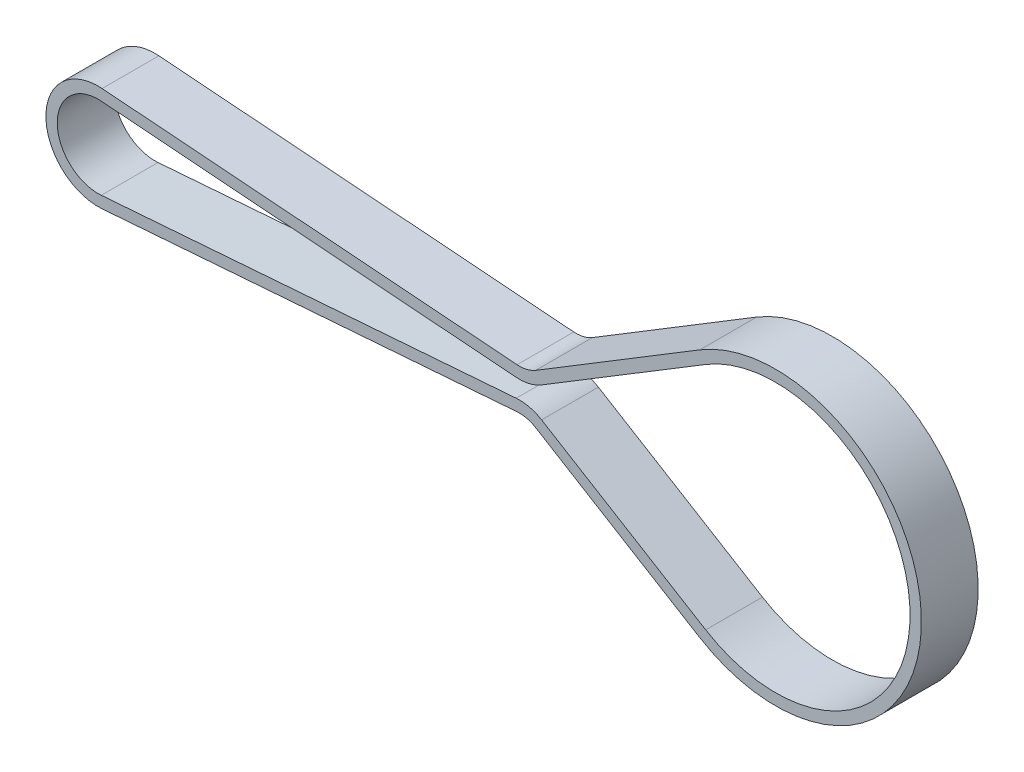
ISO-10303-21;
HEADER;
FILE_DESCRIPTION(('STEP AP214'),'2;1');
FILE_NAME('part.step','',(''),(''),'','','');
FILE_SCHEMA(('AUTOMOTIVE_DESIGN { 1 0 10303 214 1 1 1 1 }'));
ENDSEC;
DATA;
#1=APPLICATION_CONTEXT('core data for automotive mechanical design processes');
#2=APPLICATION_PROTOCOL_DEFINITION('international standard','automotive_design',2000,#1);
#3=PRODUCT_CONTEXT('',#1,'mechanical');
#4=PRODUCT('Part','Part','',(#3));
#5=PRODUCT_RELATED_PRODUCT_CATEGORY('part','',(#4));
#6=PRODUCT_DEFINITION_FORMATION('','',#4);
#7=PRODUCT_DEFINITION_CONTEXT('part definition',#1,'design');
#8=PRODUCT_DEFINITION('design','',#6,#7);
#9=PRODUCT_DEFINITION_SHAPE('','',#8);
#10=(LENGTH_UNIT() NAMED_UNIT(*) SI_UNIT(.MILLI.,.METRE.));
#11=(NAMED_UNIT(*) PLANE_ANGLE_UNIT() SI_UNIT($,.RADIAN.));
#12=(NAMED_UNIT(*) SI_UNIT($,.STERADIAN.) SOLID_ANGLE_UNIT());
#13=UNCERTAINTY_MEASURE_WITH_UNIT(LENGTH_MEASURE(1.E-05),#10,'distance_accuracy_value','');
#14=(GEOMETRIC_REPRESENTATION_CONTEXT(3) GLOBAL_UNCERTAINTY_ASSIGNED_CONTEXT((#13)) GLOBAL_UNIT_ASSIGNED_CONTEXT((#10,
#11,#12)) REPRESENTATION_CONTEXT('',''));
#15=CARTESIAN_POINT('',(0.,0.,0.));
#16=DIRECTION('',(0.,0.,1.));
#17=DIRECTION('',(1.,0.,0.));
#18=AXIS2_PLACEMENT_3D('',#15,#16,#17);
#19=CARTESIAN_POINT('',(1.11022302462516E-12,1.45716771982052E-13,184.335803480862));
#20=DIRECTION('',(0.,0.,-1.));
#21=DIRECTION('',(-1.,0.,0.));
#22=AXIS2_PLACEMENT_3D('',#19,#20,#21);
#23=CYLINDRICAL_SURFACE('',#22,10.125);
#24=DIRECTION('',(0.,0.,-1.));
#25=VECTOR('',#24,1.);
#26=CARTESIAN_POINT('',(0.771900540083093,-10.0955333963203,184.335803480862));
#27=LINE('',#26,#25);
#28=CARTESIAN_POINT('',(0.771900540083095,-10.0955333963203,5.50000000000009));
#29=VERTEX_POINT('',#28);
#30=CARTESIAN_POINT('',(0.771900540083095,-10.0955333963203,-5.49999999999994));
#31=VERTEX_POINT('',#30);
#32=EDGE_CURVE('E270',#29,#31,#27,.T.);
#33=ORIENTED_EDGE('',*,*,#32,.F.);
#34=CARTESIAN_POINT('',(1.11022302462516E-12,1.45716771982052E-13,5.50000000000009));
#35=DIRECTION('',(0.,0.,-1.));
#36=DIRECTION('',(-1.,0.,0.));
#37=AXIS2_PLACEMENT_3D('',#34,#35,#36);
#38=CIRCLE('',#37,10.125);
#39=CARTESIAN_POINT('',(0.771872033862664,10.0955355758546,5.50000000000009));
#40=VERTEX_POINT('',#39);
#41=EDGE_CURVE('E150',#29,#40,#38,.T.);
#42=ORIENTED_EDGE('',*,*,#41,.T.);
#43=DIRECTION('',(0.,0.,-1.));
#44=VECTOR('',#43,1.);
#45=CARTESIAN_POINT('',(0.771872033862664,10.0955355758546,184.335803480862));
#46=LINE('',#45,#44);
#47=CARTESIAN_POINT('',(0.771872033862664,10.0955355758546,-5.49999999999995));
#48=VERTEX_POINT('',#47);
#49=EDGE_CURVE('E282',#40,#48,#46,.T.);
#50=ORIENTED_EDGE('',*,*,#49,.T.);
#51=CARTESIAN_POINT('',(1.11022302462516E-12,1.45716771982052E-13,-5.49999999999995));
#52=DIRECTION('',(0.,0.,1.));
#53=DIRECTION('',(1.,0.,0.));
#54=AXIS2_PLACEMENT_3D('',#51,#52,#53);
#55=CIRCLE('',#54,10.125);
#56=EDGE_CURVE('E337',#31,#48,#55,.F.);
#57=ORIENTED_EDGE('',*,*,#56,.F.);
#58=EDGE_LOOP('',(#33,#42,#50,#57));
#59=FACE_BOUND('',#58,.T.);
#60=ADVANCED_FACE('F131',(#59),#23,.T.);
#61=CARTESIAN_POINT('',(81.1786412262855,-3.9476654110058,184.335803480862));
#62=DIRECTION('',(-0.0762370903784674,0.997089718155104,0.));
#63=DIRECTION('',(-0.997089718155104,-0.0762370903784674,0.));
#64=AXIS2_PLACEMENT_3D('',#61,#62,#63);
#65=PLANE('',#64);
#66=DIRECTION('',(0.,0.,-1.));
#67=VECTOR('',#66,1.);
#68=CARTESIAN_POINT('',(81.1786412262855,-3.9476654110058,184.335803480862));
#69=LINE('',#68,#67);
#70=CARTESIAN_POINT('',(81.1786412262855,-3.9476654110058,5.50000000000006));
#71=VERTEX_POINT('',#70);
#72=CARTESIAN_POINT('',(81.1786412262855,-3.9476654110058,-5.49999999999995));
#73=VERTEX_POINT('',#72);
#74=EDGE_CURVE('E230',#71,#73,#69,.T.);
#75=ORIENTED_EDGE('',*,*,#74,.F.);
#76=DIRECTION('',(-0.997089718155104,-0.0762370903784674,0.));
#77=VECTOR('',#76,1.);
#78=CARTESIAN_POINT('',(81.1786412262855,-3.94766541100581,5.50000000000006));
#79=LINE('',#78,#77);
#80=EDGE_CURVE('E273',#71,#29,#79,.T.);
#81=ORIENTED_EDGE('',*,*,#80,.T.);
#82=ORIENTED_EDGE('',*,*,#32,.T.);
#83=DIRECTION('',(-0.997089718155104,-0.0762370903784674,0.));
#84=VECTOR('',#83,1.);
#85=CARTESIAN_POINT('',(81.1786412262856,-3.9476654110058,-5.49999999999998));
#86=LINE('',#85,#84);
#87=EDGE_CURVE('E305',#73,#31,#86,.T.);
#88=ORIENTED_EDGE('',*,*,#87,.F.);
#89=EDGE_LOOP('',(#75,#81,#82,#88));
#90=FACE_BOUND('',#89,.T.);
#91=ADVANCED_FACE('F409',(#90),#65,.F.);
#92=CARTESIAN_POINT('',(81.6414003648828,-10.0000000002073,184.335803480862));
#93=DIRECTION('',(0.,0.,-1.));
#94=DIRECTION('',(-1.,0.,0.));
#95=AXIS2_PLACEMENT_3D('',#92,#93,#94);
#96=CYLINDRICAL_SURFACE('',#95,6.07);
#97=DIRECTION('',(0.,0.,-1.));
#98=VECTOR('',#97,1.);
#99=CARTESIAN_POINT('',(84.7954679352214,-4.81379158155124,184.335803480862));
#100=LINE('',#99,#98);
#101=CARTESIAN_POINT('',(84.7954679352214,-4.81379158155124,5.50000000000007));
#102=VERTEX_POINT('',#101);
#103=CARTESIAN_POINT('',(84.7954679352214,-4.81379158155124,-5.49999999999998));
#104=VERTEX_POINT('',#103);
#105=EDGE_CURVE('E229',#102,#104,#100,.T.);
#106=ORIENTED_EDGE('',*,*,#105,.F.);
#107=CARTESIAN_POINT('',(81.6414003648828,-10.0000000002073,5.50000000000006));
#108=DIRECTION('',(0.,0.,-1.));
#109=DIRECTION('',(-1.,0.,0.));
#110=AXIS2_PLACEMENT_3D('',#107,#108,#109);
#111=CIRCLE('',#110,6.07);
#112=EDGE_CURVE('E225',#102,#71,#111,.F.);
#113=ORIENTED_EDGE('',*,*,#112,.T.);
#114=ORIENTED_EDGE('',*,*,#74,.T.);
#115=CARTESIAN_POINT('',(81.6414003648828,-10.0000000002073,-5.49999999999998));
#116=DIRECTION('',(0.,0.,1.));
#117=DIRECTION('',(1.,0.,0.));
#118=AXIS2_PLACEMENT_3D('',#115,#116,#117);
#119=CIRCLE('',#118,6.07);
#120=EDGE_CURVE('E314',#104,#73,#119,.T.);
#121=ORIENTED_EDGE('',*,*,#120,.F.);
#122=EDGE_LOOP('',(#106,#113,#114,#121));
#123=FACE_BOUND('',#122,.T.);
#124=ADVANCED_FACE('F308',(#123),#96,.F.);
#125=CARTESIAN_POINT('',(116.589214662141,-24.1496179494628,184.335803480862));
#126=DIRECTION('',(0.519615744701569,0.854400068971342,0.));
#127=DIRECTION('',(-0.854400068971342,0.519615744701569,0.));
#128=AXIS2_PLACEMENT_3D('',#125,#126,#127);
#129=PLANE('',#128);
#130=DIRECTION('',(0.,0.,-1.));
#131=VECTOR('',#130,1.);
#132=CARTESIAN_POINT('',(116.589214662141,-24.1496179494628,184.335803480862));
#133=LINE('',#132,#131);
#134=CARTESIAN_POINT('',(116.589214662141,-24.1496179494628,5.50000000000004));
#135=VERTEX_POINT('',#134);
#136=CARTESIAN_POINT('',(116.589214662141,-24.1496179494628,-5.49999999999998));
#137=VERTEX_POINT('',#136);
#138=EDGE_CURVE('E234',#135,#137,#133,.T.);
#139=ORIENTED_EDGE('',*,*,#138,.F.);
#140=DIRECTION('',(-0.854400068971342,0.519615744701569,0.));
#141=VECTOR('',#140,1.);
#142=CARTESIAN_POINT('',(116.589214662141,-24.1496179494627,5.50000000000006));
#143=LINE('',#142,#141);
#144=EDGE_CURVE('E219',#135,#102,#143,.T.);
#145=ORIENTED_EDGE('',*,*,#144,.T.);
#146=ORIENTED_EDGE('',*,*,#105,.T.);
#147=DIRECTION('',(-0.854400068971342,0.519615744701569,0.));
#148=VECTOR('',#147,1.);
#149=CARTESIAN_POINT('',(116.589214662141,-24.1496179494628,-5.49999999999998));
#150=LINE('',#149,#148);
#151=EDGE_CURVE('E238',#137,#104,#150,.T.);
#152=ORIENTED_EDGE('',*,*,#151,.F.);
#153=EDGE_LOOP('',(#139,#145,#146,#152));
#154=FACE_BOUND('',#153,.T.);
#155=ADVANCED_FACE('F235',(#154),#129,.F.);
#156=CARTESIAN_POINT('',(131.276153686131,1.22193921647806E-11,184.335803480862));
#157=DIRECTION('',(0.,0.,-1.));
#158=DIRECTION('',(-1.,0.,0.));
#159=AXIS2_PLACEMENT_3D('',#156,#157,#158);
#160=CYLINDRICAL_SURFACE('',#159,28.265);
#161=DIRECTION('',(0.,0.,-1.));
#162=VECTOR('',#161,1.);
#163=CARTESIAN_POINT('',(116.589341289358,24.1496949592038,184.335803480862));
#164=LINE('',#163,#162);
#165=CARTESIAN_POINT('',(116.589341289358,24.1496949592038,5.50000000000004));
#166=VERTEX_POINT('',#165);
#167=CARTESIAN_POINT('',(116.589341289358,24.1496949592038,-5.50000000000001));
#168=VERTEX_POINT('',#167);
#169=EDGE_CURVE('E245',#166,#168,#164,.T.);
#170=ORIENTED_EDGE('',*,*,#169,.F.);
#171=CARTESIAN_POINT('',(131.276153686131,1.22193921647806E-11,5.50000000000003));
#172=DIRECTION('',(0.,0.,-1.));
#173=DIRECTION('',(-1.,0.,0.));
#174=AXIS2_PLACEMENT_3D('',#171,#172,#173);
#175=CIRCLE('',#174,28.265);
#176=EDGE_CURVE('E222',#166,#135,#175,.T.);
#177=ORIENTED_EDGE('',*,*,#176,.T.);
#178=ORIENTED_EDGE('',*,*,#138,.T.);
#179=CARTESIAN_POINT('',(131.276153686131,1.22193921647806E-11,-5.50000000000001));
#180=DIRECTION('',(0.,0.,1.));
#181=DIRECTION('',(1.,0.,0.));
#182=AXIS2_PLACEMENT_3D('',#179,#180,#181);
#183=CIRCLE('',#182,28.265);
#184=EDGE_CURVE('E324',#168,#137,#183,.F.);
#185=ORIENTED_EDGE('',*,*,#184,.F.);
#186=EDGE_LOOP('',(#170,#177,#178,#185));
#187=FACE_BOUND('',#186,.T.);
#188=ADVANCED_FACE('F243',(#187),#160,.T.);
#189=CARTESIAN_POINT('',(84.7954407411231,4.81400341102333,184.335803480862));
#190=DIRECTION('',(0.519611264700962,-0.85440279353234,0.));
#191=DIRECTION('',(0.85440279353234,0.519611264700962,0.));
#192=AXIS2_PLACEMENT_3D('',#189,#190,#191);
#193=PLANE('',#192);
#194=DIRECTION('',(0.,0.,-1.));
#195=VECTOR('',#194,1.);
#196=CARTESIAN_POINT('',(84.7954407411231,4.81400341102333,184.335803480862));
#197=LINE('',#196,#195);
#198=CARTESIAN_POINT('',(84.7954407411231,4.81400341102332,5.50000000000006));
#199=VERTEX_POINT('',#198);
#200=CARTESIAN_POINT('',(84.7954407411231,4.81400341102333,-5.49999999999998));
#201=VERTEX_POINT('',#200);
#202=EDGE_CURVE('E252',#199,#201,#197,.T.);
#203=ORIENTED_EDGE('',*,*,#202,.F.);
#204=DIRECTION('',(0.85440279353234,0.519611264700962,0.));
#205=VECTOR('',#204,1.);
#206=CARTESIAN_POINT('',(84.795440741123,4.81400341102328,5.50000000000006));
#207=LINE('',#206,#205);
#208=EDGE_CURVE('E167',#199,#166,#207,.T.);
#209=ORIENTED_EDGE('',*,*,#208,.T.);
#210=ORIENTED_EDGE('',*,*,#169,.T.);
#211=DIRECTION('',(0.85440279353234,0.519611264700962,0.));
#212=VECTOR('',#211,1.);
#213=CARTESIAN_POINT('',(84.7954407411232,4.81400341102337,-5.49999999999998));
#214=LINE('',#213,#212);
#215=EDGE_CURVE('E326',#201,#168,#214,.T.);
#216=ORIENTED_EDGE('',*,*,#215,.F.);
#217=EDGE_LOOP('',(#203,#209,#210,#216));
#218=FACE_BOUND('',#217,.T.);
#219=ADVANCED_FACE('F437',(#218),#193,.F.);
#220=CARTESIAN_POINT('',(81.6414003643883,10.0002283677646,184.335803480862));
#221=DIRECTION('',(0.,0.,-1.));
#222=DIRECTION('',(-1.,0.,0.));
#223=AXIS2_PLACEMENT_3D('',#220,#221,#222);
#224=CYLINDRICAL_SURFACE('',#223,6.07);
#225=DIRECTION('',(0.,0.,-1.));
#226=VECTOR('',#225,1.);
#227=CARTESIAN_POINT('',(81.1786583154461,3.94789247191906,184.335803480862));
#228=LINE('',#227,#226);
#229=CARTESIAN_POINT('',(81.1786583154461,3.94789247191906,5.50000000000006));
#230=VERTEX_POINT('',#229);
#231=CARTESIAN_POINT('',(81.1786583154461,3.94789247191906,-5.49999999999998));
#232=VERTEX_POINT('',#231);
#233=EDGE_CURVE('E256',#230,#232,#228,.T.);
#234=ORIENTED_EDGE('',*,*,#233,.F.);
#235=CARTESIAN_POINT('',(81.6414003643883,10.0002283677646,5.50000000000006));
#236=DIRECTION('',(0.,0.,-1.));
#237=DIRECTION('',(-1.,0.,0.));
#238=AXIS2_PLACEMENT_3D('',#235,#236,#237);
#239=CIRCLE('',#238,6.07);
#240=EDGE_CURVE('E161',#230,#199,#239,.F.);
#241=ORIENTED_EDGE('',*,*,#240,.T.);
#242=ORIENTED_EDGE('',*,*,#202,.T.);
#243=CARTESIAN_POINT('',(81.6414003643883,10.0002283677646,-5.49999999999998));
#244=DIRECTION('',(0.,0.,1.));
#245=DIRECTION('',(1.,0.,0.));
#246=AXIS2_PLACEMENT_3D('',#243,#244,#245);
#247=CIRCLE('',#246,6.07);
#248=EDGE_CURVE('E332',#232,#201,#247,.T.);
#249=ORIENTED_EDGE('',*,*,#248,.F.);
#250=EDGE_LOOP('',(#234,#241,#242,#249));
#251=FACE_BOUND('',#250,.T.);
#252=ADVANCED_FACE('F433',(#251),#224,.F.);
#253=CARTESIAN_POINT('',(0.771872033862664,10.0955355758546,184.335803480862));
#254=DIRECTION('',(-0.0762342749492893,-0.997089933417721,0.));
#255=DIRECTION('',(0.997089933417721,-0.0762342749492893,0.));
#256=AXIS2_PLACEMENT_3D('',#253,#254,#255);
#257=PLANE('',#256);
#258=ORIENTED_EDGE('',*,*,#49,.F.);
#259=DIRECTION('',(0.997089933417721,-0.0762342749492893,0.));
#260=VECTOR('',#259,1.);
#261=CARTESIAN_POINT('',(0.771872033862602,10.0955355758546,5.50000000000009));
#262=LINE('',#261,#260);
#263=EDGE_CURVE('E253',#40,#230,#262,.T.);
#264=ORIENTED_EDGE('',*,*,#263,.T.);
#265=ORIENTED_EDGE('',*,*,#233,.T.);
#266=DIRECTION('',(0.997089933417721,-0.0762342749492893,0.));
#267=VECTOR('',#266,1.);
#268=CARTESIAN_POINT('',(0.771872033862726,10.0955355758546,-5.49999999999995));
#269=LINE('',#268,#267);
#270=EDGE_CURVE('E335',#48,#232,#269,.T.);
#271=ORIENTED_EDGE('',*,*,#270,.F.);
#272=EDGE_LOOP('',(#258,#264,#265,#271));
#273=FACE_BOUND('',#272,.T.);
#274=ADVANCED_FACE('F430',(#273),#257,.F.);
#275=CARTESIAN_POINT('',(1.11022302462516E-12,1.45716771982052E-13,184.335803480862));
#276=DIRECTION('',(0.,0.,-1.));
#277=DIRECTION('',(-1.,0.,0.));
#278=AXIS2_PLACEMENT_3D('',#275,#276,#277);
#279=CYLINDRICAL_SURFACE('',#278,7.925);
#280=CARTESIAN_POINT('',(1.11022302462516E-12,1.45716771982052E-13,5.50000000000009));
#281=DIRECTION('',(0.,0.,-1.));
#282=DIRECTION('',(-1.,0.,0.));
#283=AXIS2_PLACEMENT_3D('',#280,#281,#282);
#284=CIRCLE('',#283,7.925);
#285=CARTESIAN_POINT('',(0.604178941250449,-7.90193601637906,5.50000000000009));
#286=VERTEX_POINT('',#285);
#287=CARTESIAN_POINT('',(0.604156628974228,7.90193772233559,5.50000000000006));
#288=VERTEX_POINT('',#287);
#289=EDGE_CURVE('E198',#286,#288,#284,.T.);
#290=ORIENTED_EDGE('',*,*,#289,.F.);
#291=DIRECTION('',(0.,0.,-1.));
#292=VECTOR('',#291,1.);
#293=CARTESIAN_POINT('',(0.604178941250449,-7.90193601637906,184.335803480862));
#294=LINE('',#293,#292);
#295=CARTESIAN_POINT('',(0.604178941250449,-7.90193601637906,-5.49999999999998));
#296=VERTEX_POINT('',#295);
#297=EDGE_CURVE('E281',#286,#296,#294,.T.);
#298=ORIENTED_EDGE('',*,*,#297,.T.);
#299=CARTESIAN_POINT('',(1.11022302462516E-12,1.45716771982052E-13,-5.49999999999995));
#300=DIRECTION('',(0.,0.,1.));
#301=DIRECTION('',(1.,0.,0.));
#302=AXIS2_PLACEMENT_3D('',#299,#300,#301);
#303=CIRCLE('',#302,7.925);
#304=CARTESIAN_POINT('',(0.604156628974228,7.90193772233559,-5.49999999999995));
#305=VERTEX_POINT('',#304);
#306=EDGE_CURVE('E338',#296,#305,#303,.F.);
#307=ORIENTED_EDGE('',*,*,#306,.T.);
#308=DIRECTION('',(0.,0.,-1.));
#309=VECTOR('',#308,1.);
#310=CARTESIAN_POINT('',(0.604156628974228,7.90193772233559,184.335803480862));
#311=LINE('',#310,#309);
#312=EDGE_CURVE('E257',#288,#305,#311,.T.);
#313=ORIENTED_EDGE('',*,*,#312,.F.);
#314=EDGE_LOOP('',(#290,#298,#307,#313));
#315=FACE_BOUND('',#314,.T.);
#316=ADVANCED_FACE('F383',(#315),#279,.F.);
#317=CARTESIAN_POINT('',(0.604178941250465,-7.90193601637906,184.335803480862));
#318=DIRECTION('',(-0.0762370903784674,0.997089718155104,0.));
#319=DIRECTION('',(-0.997089718155104,-0.0762370903784674,0.));
#320=AXIS2_PLACEMENT_3D('',#317,#318,#319);
#321=PLANE('',#320);
#322=DIRECTION('',(-0.997089718155104,-0.0762370903784674,0.));
#323=VECTOR('',#322,1.);
#324=CARTESIAN_POINT('',(0.604178941250395,-7.90193601637906,5.50000000000009));
#325=LINE('',#324,#323);
#326=CARTESIAN_POINT('',(81.0109196274529,-1.75406803106457,5.50000000000006));
#327=VERTEX_POINT('',#326);
#328=EDGE_CURVE('E12',#327,#286,#325,.T.);
#329=ORIENTED_EDGE('',*,*,#328,.F.);
#330=DIRECTION('',(0.,0.,-1.));
#331=VECTOR('',#330,1.);
#332=CARTESIAN_POINT('',(81.0109196274529,-1.75406803106457,184.335803480862));
#333=LINE('',#332,#331);
#334=CARTESIAN_POINT('',(81.0109196274529,-1.75406803106457,-5.49999999999998));
#335=VERTEX_POINT('',#334);
#336=EDGE_CURVE('E207',#327,#335,#333,.T.);
#337=ORIENTED_EDGE('',*,*,#336,.T.);
#338=DIRECTION('',(-0.997089718155104,-0.0762370903784674,0.));
#339=VECTOR('',#338,1.);
#340=CARTESIAN_POINT('',(0.604178941250535,-7.90193601637905,-5.49999999999995));
#341=LINE('',#340,#339);
#342=EDGE_CURVE('E268',#335,#296,#341,.T.);
#343=ORIENTED_EDGE('',*,*,#342,.T.);
#344=ORIENTED_EDGE('',*,*,#297,.F.);
#345=EDGE_LOOP('',(#329,#337,#343,#344));
#346=FACE_BOUND('',#345,.T.);
#347=ADVANCED_FACE('F386',(#346),#321,.T.);
#348=CARTESIAN_POINT('',(81.6414003648828,-10.0000000002073,184.335803480862));
#349=DIRECTION('',(0.,0.,-1.));
#350=DIRECTION('',(-1.,0.,0.));
#351=AXIS2_PLACEMENT_3D('',#348,#349,#350);
#352=CYLINDRICAL_SURFACE('',#351,8.27);
#353=CARTESIAN_POINT('',(81.6414003648828,-10.0000000002073,5.50000000000006));
#354=DIRECTION('',(0.,0.,-1.));
#355=DIRECTION('',(-1.,0.,0.));
#356=AXIS2_PLACEMENT_3D('',#353,#354,#355);
#357=CIRCLE('',#356,8.27);
#358=CARTESIAN_POINT('',(85.9386225735648,-2.93411142981428,5.50000000000005));
#359=VERTEX_POINT('',#358);
#360=EDGE_CURVE('E141',#359,#327,#357,.F.);
#361=ORIENTED_EDGE('',*,*,#360,.F.);
#362=DIRECTION('',(0.,0.,-1.));
#363=VECTOR('',#362,1.);
#364=CARTESIAN_POINT('',(85.9386225735648,-2.93411142981428,184.335803480862));
#365=LINE('',#364,#363);
#366=CARTESIAN_POINT('',(85.9386225735648,-2.93411142981429,-5.49999999999998));
#367=VERTEX_POINT('',#366);
#368=EDGE_CURVE('E288',#359,#367,#365,.T.);
#369=ORIENTED_EDGE('',*,*,#368,.T.);
#370=CARTESIAN_POINT('',(81.6414003648828,-10.0000000002073,-5.49999999999998));
#371=DIRECTION('',(0.,0.,1.));
#372=DIRECTION('',(1.,0.,0.));
#373=AXIS2_PLACEMENT_3D('',#370,#371,#372);
#374=CIRCLE('',#373,8.27);
#375=EDGE_CURVE('E352',#367,#335,#374,.T.);
#376=ORIENTED_EDGE('',*,*,#375,.T.);
#377=ORIENTED_EDGE('',*,*,#336,.F.);
#378=EDGE_LOOP('',(#361,#369,#376,#377));
#379=FACE_BOUND('',#378,.T.);
#380=ADVANCED_FACE('F481',(#379),#352,.T.);
#381=CARTESIAN_POINT('',(21.9008456543779,36.0113877003038,184.335803480862));
#382=DIRECTION('',(0.519615744701569,0.854400068971342,0.));
#383=DIRECTION('',(-0.854400068971342,0.519615744701569,0.));
#384=AXIS2_PLACEMENT_3D('',#381,#382,#383);
#385=PLANE('',#384);
#386=DIRECTION('',(-0.854400068971342,0.519615744701569,0.));
#387=VECTOR('',#386,1.);
#388=CARTESIAN_POINT('',(21.9008456543779,36.0113877003039,5.50000000000006));
#389=LINE('',#388,#387);
#390=CARTESIAN_POINT('',(117.732369300485,-22.2699377977258,5.50000000000004));
#391=VERTEX_POINT('',#390);
#392=EDGE_CURVE('E260',#391,#359,#389,.T.);
#393=ORIENTED_EDGE('',*,*,#392,.F.);
#394=DIRECTION('',(0.,0.,-1.));
#395=VECTOR('',#394,1.);
#396=CARTESIAN_POINT('',(117.732369300485,-22.2699377977258,184.335803480862));
#397=LINE('',#396,#395);
#398=CARTESIAN_POINT('',(117.732369300485,-22.2699377977258,-5.5));
#399=VERTEX_POINT('',#398);
#400=EDGE_CURVE('E290',#391,#399,#397,.T.);
#401=ORIENTED_EDGE('',*,*,#400,.T.);
#402=DIRECTION('',(-0.854400068971342,0.519615744701569,0.));
#403=VECTOR('',#402,1.);
#404=CARTESIAN_POINT('',(21.9008456543779,36.0113877003038,-5.49999999999998));
#405=LINE('',#404,#403);
#406=EDGE_CURVE('E354',#399,#367,#405,.T.);
#407=ORIENTED_EDGE('',*,*,#406,.T.);
#408=ORIENTED_EDGE('',*,*,#368,.F.);
#409=EDGE_LOOP('',(#393,#401,#407,#408));
#410=FACE_BOUND('',#409,.T.);
#411=ADVANCED_FACE('F392',(#410),#385,.T.);
#412=CARTESIAN_POINT('',(131.276153686131,1.22193921647806E-11,184.335803480862));
#413=DIRECTION('',(0.,0.,-1.));
#414=DIRECTION('',(-1.,0.,0.));
#415=AXIS2_PLACEMENT_3D('',#412,#413,#414);
#416=CYLINDRICAL_SURFACE('',#415,26.065);
#417=CARTESIAN_POINT('',(131.276153686131,1.22193921647806E-11,5.50000000000003));
#418=DIRECTION('',(0.,0.,-1.));
#419=DIRECTION('',(-1.,0.,0.));
#420=AXIS2_PLACEMENT_3D('',#417,#418,#419);
#421=CIRCLE('',#420,26.065);
#422=CARTESIAN_POINT('',(117.7324860717,22.2700088134327,5.50000000000004));
#423=VERTEX_POINT('',#422);
#424=EDGE_CURVE('E262',#423,#391,#421,.T.);
#425=ORIENTED_EDGE('',*,*,#424,.F.);
#426=DIRECTION('',(0.,0.,-1.));
#427=VECTOR('',#426,1.);
#428=CARTESIAN_POINT('',(117.7324860717,22.2700088134327,184.335803480862));
#429=LINE('',#428,#427);
#430=CARTESIAN_POINT('',(117.7324860717,22.2700088134327,-5.50000000000001));
#431=VERTEX_POINT('',#430);
#432=EDGE_CURVE('E293',#423,#431,#429,.T.);
#433=ORIENTED_EDGE('',*,*,#432,.T.);
#434=CARTESIAN_POINT('',(131.276153686131,1.22193921647806E-11,-5.50000000000001));
#435=DIRECTION('',(0.,0.,1.));
#436=DIRECTION('',(1.,0.,0.));
#437=AXIS2_PLACEMENT_3D('',#434,#435,#436);
#438=CIRCLE('',#437,26.065);
#439=EDGE_CURVE('E359',#431,#399,#438,.F.);
#440=ORIENTED_EDGE('',*,*,#439,.T.);
#441=ORIENTED_EDGE('',*,*,#400,.F.);
#442=EDGE_LOOP('',(#425,#433,#440,#441));
#443=FACE_BOUND('',#442,.T.);
#444=ADVANCED_FACE('F395',(#443),#416,.F.);
#445=CARTESIAN_POINT('',(21.9003512382539,-36.0110000464891,184.335803480862));
#446=DIRECTION('',(0.519611264700962,-0.85440279353234,0.));
#447=DIRECTION('',(0.85440279353234,0.519611264700962,0.));
#448=AXIS2_PLACEMENT_3D('',#445,#446,#447);
#449=PLANE('',#448);
#450=DIRECTION('',(0.85440279353234,0.519611264700962,0.));
#451=VECTOR('',#450,1.);
#452=CARTESIAN_POINT('',(21.9003512382538,-36.0110000464891,5.50000000000009));
#453=LINE('',#452,#451);
#454=CARTESIAN_POINT('',(85.9385855234652,2.93431726525218,5.50000000000006));
#455=VERTEX_POINT('',#454);
#456=EDGE_CURVE('E263',#455,#423,#453,.T.);
#457=ORIENTED_EDGE('',*,*,#456,.F.);
#458=DIRECTION('',(0.,0.,-1.));
#459=VECTOR('',#458,1.);
#460=CARTESIAN_POINT('',(85.9385855234652,2.93431726525218,184.335803480862));
#461=LINE('',#460,#459);
#462=CARTESIAN_POINT('',(85.9385855234652,2.93431726525217,-5.49999999999998));
#463=VERTEX_POINT('',#462);
#464=EDGE_CURVE('E296',#455,#463,#461,.T.);
#465=ORIENTED_EDGE('',*,*,#464,.T.);
#466=DIRECTION('',(0.85440279353234,0.519611264700962,0.));
#467=VECTOR('',#466,1.);
#468=CARTESIAN_POINT('',(21.900351238254,-36.011000046489,-5.49999999999995));
#469=LINE('',#468,#467);
#470=EDGE_CURVE('E364',#463,#431,#469,.T.);
#471=ORIENTED_EDGE('',*,*,#470,.T.);
#472=ORIENTED_EDGE('',*,*,#432,.F.);
#473=EDGE_LOOP('',(#457,#465,#471,#472));
#474=FACE_BOUND('',#473,.T.);
#475=ADVANCED_FACE('F399',(#474),#449,.T.);
#476=CARTESIAN_POINT('',(81.6414003643883,10.0002283677646,184.335803480862));
#477=DIRECTION('',(0.,0.,-1.));
#478=DIRECTION('',(-1.,0.,0.));
#479=AXIS2_PLACEMENT_3D('',#476,#477,#478);
#480=CYLINDRICAL_SURFACE('',#479,8.27);
#481=CARTESIAN_POINT('',(81.6414003643883,10.0002283677646,5.50000000000006));
#482=DIRECTION('',(0.,0.,-1.));
#483=DIRECTION('',(-1.,0.,0.));
#484=AXIS2_PLACEMENT_3D('',#481,#482,#483);
#485=CIRCLE('',#484,8.27);
#486=CARTESIAN_POINT('',(81.0109429105577,1.75429461840008,5.50000000000006));
#487=VERTEX_POINT('',#486);
#488=EDGE_CURVE('E135',#487,#455,#485,.F.);
#489=ORIENTED_EDGE('',*,*,#488,.F.);
#490=DIRECTION('',(0.,0.,-1.));
#491=VECTOR('',#490,1.);
#492=CARTESIAN_POINT('',(81.0109429105577,1.75429461840008,184.335803480862));
#493=LINE('',#492,#491);
#494=CARTESIAN_POINT('',(81.0109429105577,1.75429461840008,-5.49999999999997));
#495=VERTEX_POINT('',#494);
#496=EDGE_CURVE('E299',#487,#495,#493,.T.);
#497=ORIENTED_EDGE('',*,*,#496,.T.);
#498=CARTESIAN_POINT('',(81.6414003643883,10.0002283677646,-5.49999999999998));
#499=DIRECTION('',(0.,0.,1.));
#500=DIRECTION('',(1.,0.,0.));
#501=AXIS2_PLACEMENT_3D('',#498,#499,#500);
#502=CIRCLE('',#501,8.27);
#503=EDGE_CURVE('E349',#495,#463,#502,.T.);
#504=ORIENTED_EDGE('',*,*,#503,.T.);
#505=ORIENTED_EDGE('',*,*,#464,.F.);
#506=EDGE_LOOP('',(#489,#497,#504,#505));
#507=FACE_BOUND('',#506,.T.);
#508=ADVANCED_FACE('F371',(#507),#480,.T.);
#509=CARTESIAN_POINT('',(0.604156628974228,7.90193772233559,184.335803480862));
#510=DIRECTION('',(-0.0762342749492893,-0.997089933417721,0.));
#511=DIRECTION('',(0.997089933417721,-0.0762342749492893,0.));
#512=AXIS2_PLACEMENT_3D('',#509,#510,#511);
#513=PLANE('',#512);
#514=DIRECTION('',(0.997089933417721,-0.0762342749492893,0.));
#515=VECTOR('',#514,1.);
#516=CARTESIAN_POINT('',(0.604156628974166,7.90193772233559,5.50000000000009));
#517=LINE('',#516,#515);
#518=EDGE_CURVE('E195',#288,#487,#517,.T.);
#519=ORIENTED_EDGE('',*,*,#518,.F.);
#520=ORIENTED_EDGE('',*,*,#312,.T.);
#521=DIRECTION('',(0.997089933417721,-0.0762342749492893,0.));
#522=VECTOR('',#521,1.);
#523=CARTESIAN_POINT('',(0.60415662897429,7.90193772233558,-5.49999999999995));
#524=LINE('',#523,#522);
#525=EDGE_CURVE('E343',#305,#495,#524,.T.);
#526=ORIENTED_EDGE('',*,*,#525,.T.);
#527=ORIENTED_EDGE('',*,*,#496,.F.);
#528=EDGE_LOOP('',(#519,#520,#526,#527));
#529=FACE_BOUND('',#528,.T.);
#530=ADVANCED_FACE('F381',(#529),#513,.T.);
#531=CARTESIAN_POINT('',(1.1094784703033E-12,1.4514101871233E-13,5.50000000000008));
#532=DIRECTION('',(0.,0.,-1.));
#533=DIRECTION('',(-0.629923921948838,-0.77665684350078,0.));
#534=AXIS2_PLACEMENT_3D('',#531,#532,#533);
#535=PLANE('',#534);
#536=ORIENTED_EDGE('',*,*,#289,.T.);
#537=ORIENTED_EDGE('',*,*,#518,.T.);
#538=ORIENTED_EDGE('',*,*,#488,.T.);
#539=ORIENTED_EDGE('',*,*,#456,.T.);
#540=ORIENTED_EDGE('',*,*,#424,.T.);
#541=ORIENTED_EDGE('',*,*,#392,.T.);
#542=ORIENTED_EDGE('',*,*,#360,.T.);
#543=ORIENTED_EDGE('',*,*,#328,.T.);
#544=EDGE_LOOP('',(#536,#537,#538,#539,#540,#541,#542,#543));
#545=FACE_BOUND('',#544,.T.);
#546=ORIENTED_EDGE('',*,*,#80,.F.);
#547=ORIENTED_EDGE('',*,*,#112,.F.);
#548=ORIENTED_EDGE('',*,*,#144,.F.);
#549=ORIENTED_EDGE('',*,*,#176,.F.);
#550=ORIENTED_EDGE('',*,*,#208,.F.);
#551=ORIENTED_EDGE('',*,*,#240,.F.);
#552=ORIENTED_EDGE('',*,*,#263,.F.);
#553=ORIENTED_EDGE('',*,*,#41,.F.);
#554=EDGE_LOOP('',(#546,#547,#548,#549,#550,#551,#552,#553));
#555=FACE_BOUND('',#554,.T.);
#556=ADVANCED_FACE('F133',(#545,#555),#535,.F.);
#557=CARTESIAN_POINT('',(1.10538342153308E-12,1.4197437572886E-13,-5.49999999999994));
#558=DIRECTION('',(0.,0.,1.));
#559=DIRECTION('',(0.629923921948838,0.77665684350078,0.));
#560=AXIS2_PLACEMENT_3D('',#557,#558,#559);
#561=PLANE('',#560);
#562=ORIENTED_EDGE('',*,*,#56,.T.);
#563=ORIENTED_EDGE('',*,*,#270,.T.);
#564=ORIENTED_EDGE('',*,*,#248,.T.);
#565=ORIENTED_EDGE('',*,*,#215,.T.);
#566=ORIENTED_EDGE('',*,*,#184,.T.);
#567=ORIENTED_EDGE('',*,*,#151,.T.);
#568=ORIENTED_EDGE('',*,*,#120,.T.);
#569=ORIENTED_EDGE('',*,*,#87,.T.);
#570=EDGE_LOOP('',(#562,#563,#564,#565,#566,#567,#568,#569));
#571=FACE_BOUND('',#570,.T.);
#572=ORIENTED_EDGE('',*,*,#342,.F.);
#573=ORIENTED_EDGE('',*,*,#375,.F.);
#574=ORIENTED_EDGE('',*,*,#406,.F.);
#575=ORIENTED_EDGE('',*,*,#439,.F.);
#576=ORIENTED_EDGE('',*,*,#470,.F.);
#577=ORIENTED_EDGE('',*,*,#503,.F.);
#578=ORIENTED_EDGE('',*,*,#525,.F.);
#579=ORIENTED_EDGE('',*,*,#306,.F.);
#580=EDGE_LOOP('',(#572,#573,#574,#575,#576,#577,#578,#579));
#581=FACE_BOUND('',#580,.T.);
#582=ADVANCED_FACE('F319',(#571,#581),#561,.F.);
#583=CLOSED_SHELL('',(#60,#91,#124,#155,#188,#219,#252,#274,#316,#347,#380,#411,#444,#475,#508,
#530,#556,#582));
#584=MANIFOLD_SOLID_BREP('B2',#583);
#585=ADVANCED_BREP_SHAPE_REPRESENTATION('',(#18,#584),#14);
#586=SHAPE_DEFINITION_REPRESENTATION(#9,#585);
ENDSEC;
END-ISO-10303-21;
